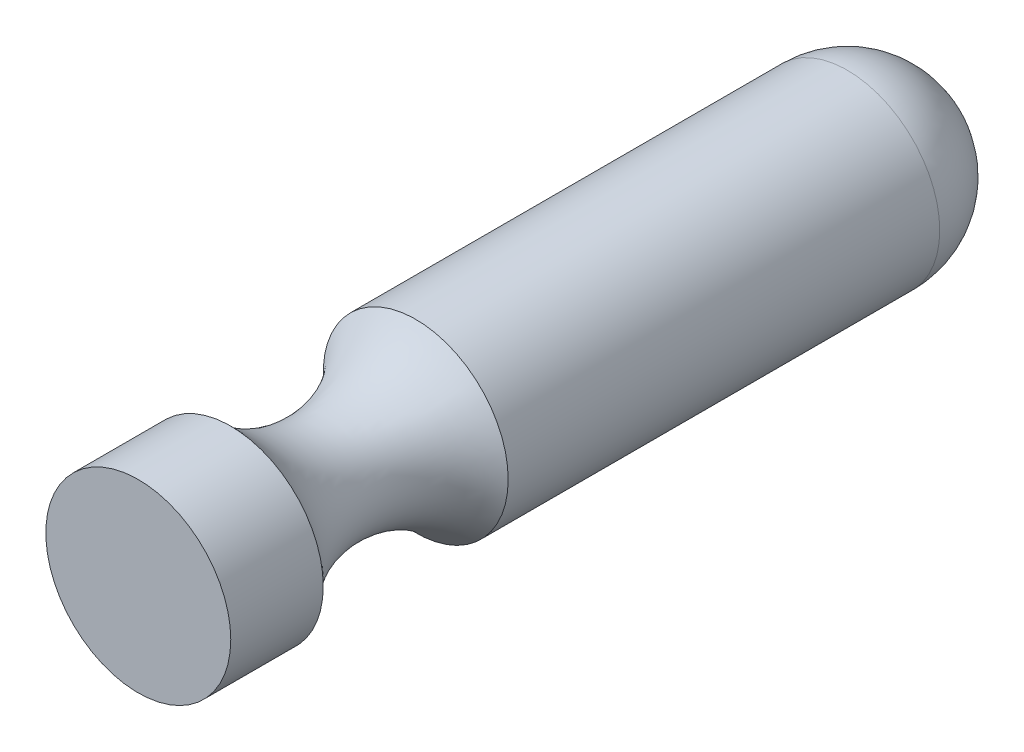
ISO-10303-21;
HEADER;
FILE_DESCRIPTION(('STEP AP214'),'2;1');
FILE_NAME('part.step','',(''),(''),'','','');
FILE_SCHEMA(('AUTOMOTIVE_DESIGN { 1 0 10303 214 1 1 1 1 }'));
ENDSEC;
DATA;
#1=APPLICATION_CONTEXT('core data for automotive mechanical design processes');
#2=APPLICATION_PROTOCOL_DEFINITION('international standard','automotive_design',2000,#1);
#3=PRODUCT_CONTEXT('',#1,'mechanical');
#4=PRODUCT('Part','Part','',(#3));
#5=PRODUCT_RELATED_PRODUCT_CATEGORY('part','',(#4));
#6=PRODUCT_DEFINITION_FORMATION('','',#4);
#7=PRODUCT_DEFINITION_CONTEXT('part definition',#1,'design');
#8=PRODUCT_DEFINITION('design','',#6,#7);
#9=PRODUCT_DEFINITION_SHAPE('','',#8);
#10=(LENGTH_UNIT() NAMED_UNIT(*) SI_UNIT(.MILLI.,.METRE.));
#11=(NAMED_UNIT(*) PLANE_ANGLE_UNIT() SI_UNIT($,.RADIAN.));
#12=(NAMED_UNIT(*) SI_UNIT($,.STERADIAN.) SOLID_ANGLE_UNIT());
#13=UNCERTAINTY_MEASURE_WITH_UNIT(LENGTH_MEASURE(1.E-05),#10,'distance_accuracy_value','');
#14=(GEOMETRIC_REPRESENTATION_CONTEXT(3) GLOBAL_UNCERTAINTY_ASSIGNED_CONTEXT((#13)) GLOBAL_UNIT_ASSIGNED_CONTEXT((#10,
#11,#12)) REPRESENTATION_CONTEXT('',''));
#15=CARTESIAN_POINT('',(0.,0.,0.));
#16=DIRECTION('',(0.,0.,1.));
#17=DIRECTION('',(1.,0.,0.));
#18=AXIS2_PLACEMENT_3D('',#15,#16,#17);
#19=CARTESIAN_POINT('',(0.,0.,0.));
#20=DIRECTION('',(0.,0.,1.));
#21=DIRECTION('',(1.,0.,0.));
#22=AXIS2_PLACEMENT_3D('',#19,#20,#21);
#23=PLANE('',#22);
#24=CARTESIAN_POINT('',(0.,0.,0.));
#25=DIRECTION('',(0.,0.,1.));
#26=DIRECTION('',(1.,0.,0.));
#27=AXIS2_PLACEMENT_3D('',#24,#25,#26);
#28=CIRCLE('',#27,19.05);
#29=CARTESIAN_POINT('',(19.05,0.,0.));
#30=VERTEX_POINT('',#29);
#31=EDGE_CURVE('E10',#30,#30,#28,.T.);
#32=ORIENTED_EDGE('',*,*,#31,.T.);
#33=EDGE_LOOP('',(#32));
#34=FACE_BOUND('',#33,.T.);
#35=ADVANCED_FACE('F30',(#34),#23,.T.);
#36=CARTESIAN_POINT('',(0.,0.,0.));
#37=DIRECTION('',(0.,0.,1.));
#38=DIRECTION('',(1.,0.,0.));
#39=AXIS2_PLACEMENT_3D('',#36,#37,#38);
#40=CYLINDRICAL_SURFACE('',#39,19.05);
#41=CARTESIAN_POINT('',(0.,0.,-19.05));
#42=DIRECTION('',(0.,0.,1.));
#43=DIRECTION('',(1.,0.,0.));
#44=AXIS2_PLACEMENT_3D('',#41,#42,#43);
#45=CIRCLE('',#44,19.05);
#46=CARTESIAN_POINT('',(19.05,0.,-19.05));
#47=VERTEX_POINT('',#46);
#48=EDGE_CURVE('E36',#47,#47,#45,.T.);
#49=ORIENTED_EDGE('',*,*,#48,.T.);
#50=EDGE_LOOP('',(#49));
#51=FACE_BOUND('',#50,.T.);
#52=ORIENTED_EDGE('',*,*,#31,.F.);
#53=EDGE_LOOP('',(#52));
#54=FACE_BOUND('',#53,.T.);
#55=ADVANCED_FACE('F62',(#51,#54),#40,.T.);
#56=CARTESIAN_POINT('',(0.,0.,-38.1));
#57=DIRECTION('',(0.,0.,1.));
#58=DIRECTION('',(1.,0.,0.));
#59=AXIS2_PLACEMENT_3D('',#56,#57,#58);
#60=TOROIDAL_SURFACE('',#59,35.8505208252601,25.4);
#61=CARTESIAN_POINT('',(0.,0.,-57.15));
#62=DIRECTION('',(0.,0.,1.));
#63=DIRECTION('',(1.,0.,0.));
#64=AXIS2_PLACEMENT_3D('',#61,#62,#63);
#65=CIRCLE('',#64,19.05);
#66=CARTESIAN_POINT('',(19.05,0.,-57.15));
#67=VERTEX_POINT('',#66);
#68=EDGE_CURVE('E40',#67,#67,#65,.T.);
#69=ORIENTED_EDGE('',*,*,#68,.T.);
#70=EDGE_LOOP('',(#69));
#71=FACE_BOUND('',#70,.T.);
#72=ORIENTED_EDGE('',*,*,#48,.F.);
#73=EDGE_LOOP('',(#72));
#74=FACE_BOUND('',#73,.T.);
#75=ADVANCED_FACE('F59',(#71,#74),#60,.F.);
#76=CARTESIAN_POINT('',(0.,0.,0.));
#77=DIRECTION('',(0.,0.,1.));
#78=DIRECTION('',(1.,0.,0.));
#79=AXIS2_PLACEMENT_3D('',#76,#77,#78);
#80=CYLINDRICAL_SURFACE('',#79,19.05);
#81=CARTESIAN_POINT('',(0.,0.,-146.05));
#82=DIRECTION('',(0.,0.,1.));
#83=DIRECTION('',(1.,0.,0.));
#84=AXIS2_PLACEMENT_3D('',#81,#82,#83);
#85=CIRCLE('',#84,19.05);
#86=CARTESIAN_POINT('',(19.05,0.,-146.05));
#87=VERTEX_POINT('',#86);
#88=EDGE_CURVE('E44',#87,#87,#85,.T.);
#89=ORIENTED_EDGE('',*,*,#88,.T.);
#90=EDGE_LOOP('',(#89));
#91=FACE_BOUND('',#90,.T.);
#92=ORIENTED_EDGE('',*,*,#68,.F.);
#93=EDGE_LOOP('',(#92));
#94=FACE_BOUND('',#93,.T.);
#95=ADVANCED_FACE('F50',(#91,#94),#80,.T.);
#96=CARTESIAN_POINT('',(0.,0.,-146.05));
#97=DIRECTION('',(0.,0.,1.));
#98=DIRECTION('',(1.,0.,0.));
#99=AXIS2_PLACEMENT_3D('',#96,#97,#98);
#100=SPHERICAL_SURFACE('',#99,19.05);
#101=ORIENTED_EDGE('',*,*,#88,.F.);
#102=EDGE_LOOP('',(#101));
#103=FACE_BOUND('',#102,.T.);
#104=ADVANCED_FACE('F53',(#103),#100,.T.);
#105=CLOSED_SHELL('',(#35,#55,#75,#95,#104));
#106=MANIFOLD_SOLID_BREP('B2',#105);
#107=ADVANCED_BREP_SHAPE_REPRESENTATION('',(#18,#106),#14);
#108=SHAPE_DEFINITION_REPRESENTATION(#9,#107);
ENDSEC;
END-ISO-10303-21;
